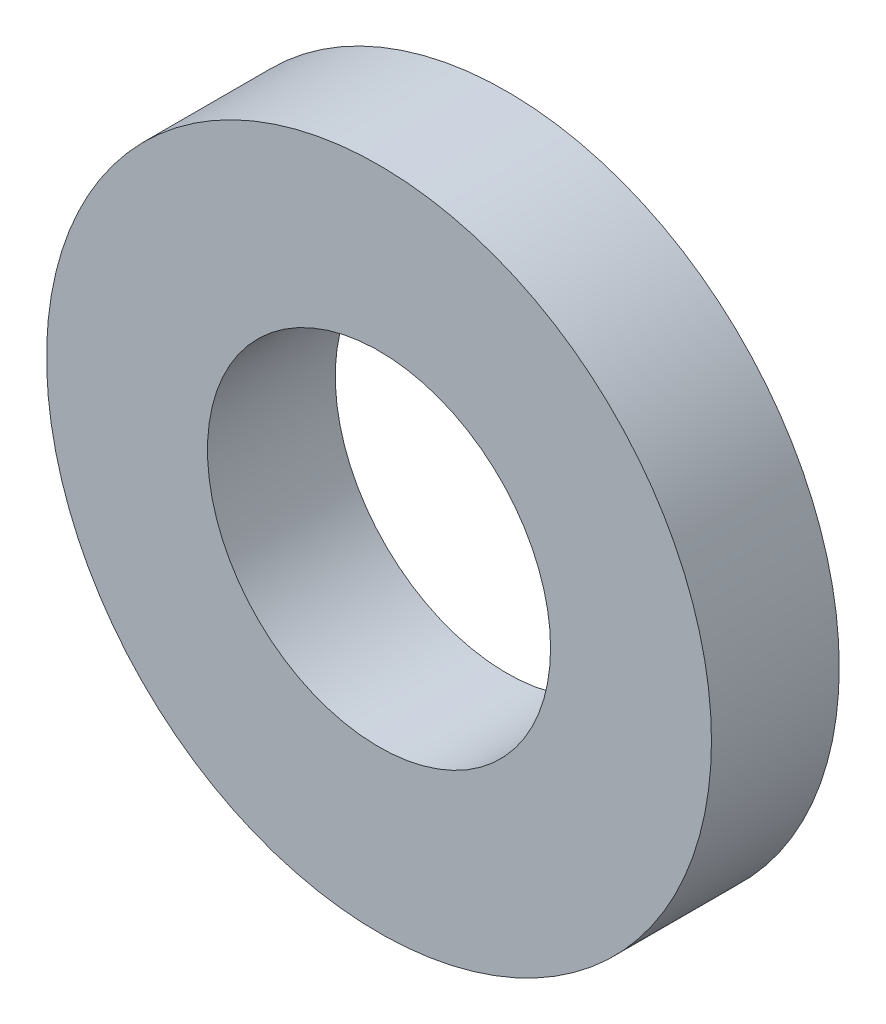
ISO-10303-21;
HEADER;
FILE_DESCRIPTION(('STEP AP214'),'2;1');
FILE_NAME('part.step','',(''),(''),'','','');
FILE_SCHEMA(('AUTOMOTIVE_DESIGN { 1 0 10303 214 1 1 1 1 }'));
ENDSEC;
DATA;
#1=APPLICATION_CONTEXT('core data for automotive mechanical design processes');
#2=APPLICATION_PROTOCOL_DEFINITION('international standard','automotive_design',2000,#1);
#3=PRODUCT_CONTEXT('',#1,'mechanical');
#4=PRODUCT('Part','Part','',(#3));
#5=PRODUCT_RELATED_PRODUCT_CATEGORY('part','',(#4));
#6=PRODUCT_DEFINITION_FORMATION('','',#4);
#7=PRODUCT_DEFINITION_CONTEXT('part definition',#1,'design');
#8=PRODUCT_DEFINITION('design','',#6,#7);
#9=PRODUCT_DEFINITION_SHAPE('','',#8);
#10=(LENGTH_UNIT() NAMED_UNIT(*) SI_UNIT(.MILLI.,.METRE.));
#11=(NAMED_UNIT(*) PLANE_ANGLE_UNIT() SI_UNIT($,.RADIAN.));
#12=(NAMED_UNIT(*) SI_UNIT($,.STERADIAN.) SOLID_ANGLE_UNIT());
#13=UNCERTAINTY_MEASURE_WITH_UNIT(LENGTH_MEASURE(1.E-05),#10,'distance_accuracy_value','');
#14=(GEOMETRIC_REPRESENTATION_CONTEXT(3) GLOBAL_UNCERTAINTY_ASSIGNED_CONTEXT((#13)) GLOBAL_UNIT_ASSIGNED_CONTEXT((#10,
#11,#12)) REPRESENTATION_CONTEXT('',''));
#15=CARTESIAN_POINT('',(0.,0.,0.));
#16=DIRECTION('',(0.,0.,1.));
#17=DIRECTION('',(1.,0.,0.));
#18=AXIS2_PLACEMENT_3D('',#15,#16,#17);
#19=CARTESIAN_POINT('',(0.,0.,-2.7432));
#20=DIRECTION('',(0.,0.,1.));
#21=DIRECTION('',(1.,0.,0.));
#22=AXIS2_PLACEMENT_3D('',#19,#20,#21);
#23=CYLINDRICAL_SURFACE('',#22,7.1374);
#24=CARTESIAN_POINT('',(0.,0.,-2.7432));
#25=DIRECTION('',(0.,0.,1.));
#26=DIRECTION('',(1.,0.,0.));
#27=AXIS2_PLACEMENT_3D('',#24,#25,#26);
#28=CIRCLE('',#27,7.1374);
#29=CARTESIAN_POINT('',(7.1374,0.,-2.7432));
#30=VERTEX_POINT('',#29);
#31=EDGE_CURVE('E10',#30,#30,#28,.T.);
#32=ORIENTED_EDGE('',*,*,#31,.T.);
#33=EDGE_LOOP('',(#32));
#34=FACE_BOUND('',#33,.T.);
#35=CARTESIAN_POINT('',(0.,0.,0.));
#36=DIRECTION('',(0.,0.,1.));
#37=DIRECTION('',(1.,0.,0.));
#38=AXIS2_PLACEMENT_3D('',#35,#36,#37);
#39=CIRCLE('',#38,7.1374);
#40=CARTESIAN_POINT('',(7.1374,0.,0.));
#41=VERTEX_POINT('',#40);
#42=EDGE_CURVE('E33',#41,#41,#39,.T.);
#43=ORIENTED_EDGE('',*,*,#42,.F.);
#44=EDGE_LOOP('',(#43));
#45=FACE_BOUND('',#44,.T.);
#46=ADVANCED_FACE('F30',(#34,#45),#23,.T.);
#47=CARTESIAN_POINT('',(0.,0.,-2.7432));
#48=DIRECTION('',(0.,0.,1.));
#49=DIRECTION('',(1.,0.,0.));
#50=AXIS2_PLACEMENT_3D('',#47,#48,#49);
#51=PLANE('',#50);
#52=CARTESIAN_POINT('',(0.,0.,-2.7432));
#53=DIRECTION('',(0.,0.,1.));
#54=DIRECTION('',(1.,0.,0.));
#55=AXIS2_PLACEMENT_3D('',#52,#53,#54);
#56=CIRCLE('',#55,3.683);
#57=CARTESIAN_POINT('',(3.683,0.,-2.7432));
#58=VERTEX_POINT('',#57);
#59=EDGE_CURVE('E40',#58,#58,#56,.T.);
#60=ORIENTED_EDGE('',*,*,#59,.T.);
#61=EDGE_LOOP('',(#60));
#62=FACE_BOUND('',#61,.T.);
#63=ORIENTED_EDGE('',*,*,#31,.F.);
#64=EDGE_LOOP('',(#63));
#65=FACE_BOUND('',#64,.T.);
#66=ADVANCED_FACE('F48',(#62,#65),#51,.F.);
#67=CARTESIAN_POINT('',(0.,0.,0.));
#68=DIRECTION('',(0.,0.,1.));
#69=DIRECTION('',(1.,0.,0.));
#70=AXIS2_PLACEMENT_3D('',#67,#68,#69);
#71=PLANE('',#70);
#72=CARTESIAN_POINT('',(0.,0.,0.));
#73=DIRECTION('',(0.,0.,1.));
#74=DIRECTION('',(1.,0.,0.));
#75=AXIS2_PLACEMENT_3D('',#72,#73,#74);
#76=CIRCLE('',#75,3.683);
#77=CARTESIAN_POINT('',(3.683,0.,0.));
#78=VERTEX_POINT('',#77);
#79=EDGE_CURVE('E42',#78,#78,#76,.T.);
#80=ORIENTED_EDGE('',*,*,#79,.F.);
#81=EDGE_LOOP('',(#80));
#82=FACE_BOUND('',#81,.T.);
#83=ORIENTED_EDGE('',*,*,#42,.T.);
#84=EDGE_LOOP('',(#83));
#85=FACE_BOUND('',#84,.T.);
#86=ADVANCED_FACE('F54',(#82,#85),#71,.T.);
#87=CARTESIAN_POINT('',(0.,0.,-2.7432));
#88=DIRECTION('',(0.,0.,1.));
#89=DIRECTION('',(1.,0.,0.));
#90=AXIS2_PLACEMENT_3D('',#87,#88,#89);
#91=CYLINDRICAL_SURFACE('',#90,3.683);
#92=ORIENTED_EDGE('',*,*,#59,.F.);
#93=EDGE_LOOP('',(#92));
#94=FACE_BOUND('',#93,.T.);
#95=ORIENTED_EDGE('',*,*,#79,.T.);
#96=EDGE_LOOP('',(#95));
#97=FACE_BOUND('',#96,.T.);
#98=ADVANCED_FACE('F51',(#94,#97),#91,.F.);
#99=CLOSED_SHELL('',(#46,#66,#86,#98));
#100=MANIFOLD_SOLID_BREP('B2',#99);
#101=ADVANCED_BREP_SHAPE_REPRESENTATION('',(#18,#100),#14);
#102=SHAPE_DEFINITION_REPRESENTATION(#9,#101);
ENDSEC;
END-ISO-10303-21;
